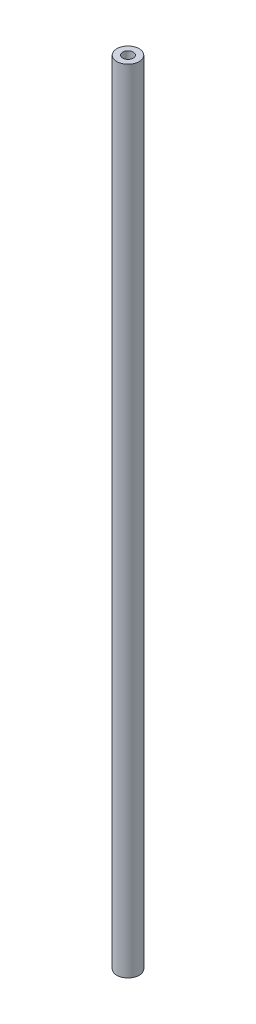
ISO-10303-21;
HEADER;
FILE_DESCRIPTION(('STEP AP214'),'2;1');
FILE_NAME('part.step','',(''),(''),'','','');
FILE_SCHEMA(('AUTOMOTIVE_DESIGN { 1 0 10303 214 1 1 1 1 }'));
ENDSEC;
DATA;
#1=APPLICATION_CONTEXT('core data for automotive mechanical design processes');
#2=APPLICATION_PROTOCOL_DEFINITION('international standard','automotive_design',2000,#1);
#3=PRODUCT_CONTEXT('',#1,'mechanical');
#4=PRODUCT('Part','Part','',(#3));
#5=PRODUCT_RELATED_PRODUCT_CATEGORY('part','',(#4));
#6=PRODUCT_DEFINITION_FORMATION('','',#4);
#7=PRODUCT_DEFINITION_CONTEXT('part definition',#1,'design');
#8=PRODUCT_DEFINITION('design','',#6,#7);
#9=PRODUCT_DEFINITION_SHAPE('','',#8);
#10=(LENGTH_UNIT() NAMED_UNIT(*) SI_UNIT(.MILLI.,.METRE.));
#11=(NAMED_UNIT(*) PLANE_ANGLE_UNIT() SI_UNIT($,.RADIAN.));
#12=(NAMED_UNIT(*) SI_UNIT($,.STERADIAN.) SOLID_ANGLE_UNIT());
#13=UNCERTAINTY_MEASURE_WITH_UNIT(LENGTH_MEASURE(1.E-05),#10,'distance_accuracy_value','');
#14=(GEOMETRIC_REPRESENTATION_CONTEXT(3) GLOBAL_UNCERTAINTY_ASSIGNED_CONTEXT((#13)) GLOBAL_UNIT_ASSIGNED_CONTEXT((#10,
#11,#12)) REPRESENTATION_CONTEXT('',''));
#15=CARTESIAN_POINT('',(0.,0.,0.));
#16=DIRECTION('',(0.,0.,1.));
#17=DIRECTION('',(1.,0.,0.));
#18=AXIS2_PLACEMENT_3D('',#15,#16,#17);
#19=CARTESIAN_POINT('',(0.,450.,0.));
#20=DIRECTION('',(0.,-1.,0.));
#21=DIRECTION('',(0.,0.,-1.));
#22=AXIS2_PLACEMENT_3D('',#19,#20,#21);
#23=CYLINDRICAL_SURFACE('',#22,6.35);
#24=CARTESIAN_POINT('',(0.,450.,0.));
#25=DIRECTION('',(0.,1.,0.));
#26=DIRECTION('',(0.,0.,1.));
#27=AXIS2_PLACEMENT_3D('',#24,#25,#26);
#28=CIRCLE('',#27,6.35);
#29=CARTESIAN_POINT('',(0.,450.,6.35));
#30=VERTEX_POINT('',#29);
#31=EDGE_CURVE('E10',#30,#30,#28,.T.);
#32=ORIENTED_EDGE('',*,*,#31,.F.);
#33=EDGE_LOOP('',(#32));
#34=FACE_BOUND('',#33,.T.);
#35=CARTESIAN_POINT('',(0.,0.,0.));
#36=DIRECTION('',(0.,1.,0.));
#37=DIRECTION('',(0.,0.,1.));
#38=AXIS2_PLACEMENT_3D('',#35,#36,#37);
#39=CIRCLE('',#38,6.35);
#40=CARTESIAN_POINT('',(0.,0.,6.35));
#41=VERTEX_POINT('',#40);
#42=EDGE_CURVE('E45',#41,#41,#39,.T.);
#43=ORIENTED_EDGE('',*,*,#42,.T.);
#44=EDGE_LOOP('',(#43));
#45=FACE_BOUND('',#44,.T.);
#46=ADVANCED_FACE('F39',(#34,#45),#23,.T.);
#47=CARTESIAN_POINT('',(0.,450.,0.));
#48=DIRECTION('',(0.,1.,0.));
#49=DIRECTION('',(0.,0.,1.));
#50=AXIS2_PLACEMENT_3D('',#47,#48,#49);
#51=PLANE('',#50);
#52=CARTESIAN_POINT('',(0.,450.,0.));
#53=DIRECTION('',(0.,1.,0.));
#54=DIRECTION('',(0.,0.,1.));
#55=AXIS2_PLACEMENT_3D('',#52,#53,#54);
#56=CIRCLE('',#55,3.);
#57=CARTESIAN_POINT('',(0.,450.,3.));
#58=VERTEX_POINT('',#57);
#59=EDGE_CURVE('E51',#58,#58,#56,.T.);
#60=ORIENTED_EDGE('',*,*,#59,.F.);
#61=EDGE_LOOP('',(#60));
#62=FACE_BOUND('',#61,.T.);
#63=ORIENTED_EDGE('',*,*,#31,.T.);
#64=EDGE_LOOP('',(#63));
#65=FACE_BOUND('',#64,.T.);
#66=ADVANCED_FACE('F79',(#62,#65),#51,.T.);
#67=CARTESIAN_POINT('',(0.,0.,0.));
#68=DIRECTION('',(0.,1.,0.));
#69=DIRECTION('',(0.,0.,1.));
#70=AXIS2_PLACEMENT_3D('',#67,#68,#69);
#71=PLANE('',#70);
#72=CARTESIAN_POINT('',(0.,0.,0.));
#73=DIRECTION('',(0.,-1.,0.));
#74=DIRECTION('',(0.,0.,-1.));
#75=AXIS2_PLACEMENT_3D('',#72,#73,#74);
#76=CIRCLE('',#75,3.);
#77=CARTESIAN_POINT('',(0.,0.,-3.));
#78=VERTEX_POINT('',#77);
#79=EDGE_CURVE('E60',#78,#78,#76,.T.);
#80=ORIENTED_EDGE('',*,*,#79,.F.);
#81=EDGE_LOOP('',(#80));
#82=FACE_BOUND('',#81,.T.);
#83=ORIENTED_EDGE('',*,*,#42,.F.);
#84=EDGE_LOOP('',(#83));
#85=FACE_BOUND('',#84,.T.);
#86=ADVANCED_FACE('F75',(#82,#85),#71,.F.);
#87=CARTESIAN_POINT('',(0.,426.,0.));
#88=DIRECTION('',(0.,1.,0.));
#89=DIRECTION('',(0.,0.,1.));
#90=AXIS2_PLACEMENT_3D('',#87,#88,#89);
#91=CYLINDRICAL_SURFACE('',#90,3.);
#92=CARTESIAN_POINT('',(0.,426.,0.));
#93=DIRECTION('',(0.,1.,0.));
#94=DIRECTION('',(0.,0.,1.));
#95=AXIS2_PLACEMENT_3D('',#92,#93,#94);
#96=CIRCLE('',#95,3.);
#97=CARTESIAN_POINT('',(0.,426.,3.));
#98=VERTEX_POINT('',#97);
#99=EDGE_CURVE('E47',#98,#98,#96,.T.);
#100=ORIENTED_EDGE('',*,*,#99,.F.);
#101=EDGE_LOOP('',(#100));
#102=FACE_BOUND('',#101,.T.);
#103=ORIENTED_EDGE('',*,*,#59,.T.);
#104=EDGE_LOOP('',(#103));
#105=FACE_BOUND('',#104,.T.);
#106=ADVANCED_FACE('F73',(#102,#105),#91,.F.);
#107=CARTESIAN_POINT('',(0.,426.,0.));
#108=DIRECTION('',(0.,1.,0.));
#109=DIRECTION('',(0.,0.,1.));
#110=AXIS2_PLACEMENT_3D('',#107,#108,#109);
#111=PLANE('',#110);
#112=ORIENTED_EDGE('',*,*,#99,.T.);
#113=EDGE_LOOP('',(#112));
#114=FACE_BOUND('',#113,.T.);
#115=ADVANCED_FACE('F68',(#114),#111,.T.);
#116=CARTESIAN_POINT('',(0.,24.,0.));
#117=DIRECTION('',(0.,-1.,0.));
#118=DIRECTION('',(0.,0.,-1.));
#119=AXIS2_PLACEMENT_3D('',#116,#117,#118);
#120=CYLINDRICAL_SURFACE('',#119,3.);
#121=CARTESIAN_POINT('',(0.,24.,0.));
#122=DIRECTION('',(0.,-1.,0.));
#123=DIRECTION('',(0.,0.,-1.));
#124=AXIS2_PLACEMENT_3D('',#121,#122,#123);
#125=CIRCLE('',#124,3.);
#126=CARTESIAN_POINT('',(0.,24.,-3.));
#127=VERTEX_POINT('',#126);
#128=EDGE_CURVE('E53',#127,#127,#125,.T.);
#129=ORIENTED_EDGE('',*,*,#128,.F.);
#130=EDGE_LOOP('',(#129));
#131=FACE_BOUND('',#130,.T.);
#132=ORIENTED_EDGE('',*,*,#79,.T.);
#133=EDGE_LOOP('',(#132));
#134=FACE_BOUND('',#133,.T.);
#135=ADVANCED_FACE('F62',(#131,#134),#120,.F.);
#136=CARTESIAN_POINT('',(0.,24.,0.));
#137=DIRECTION('',(0.,-1.,0.));
#138=DIRECTION('',(0.,0.,-1.));
#139=AXIS2_PLACEMENT_3D('',#136,#137,#138);
#140=PLANE('',#139);
#141=ORIENTED_EDGE('',*,*,#128,.T.);
#142=EDGE_LOOP('',(#141));
#143=FACE_BOUND('',#142,.T.);
#144=ADVANCED_FACE('F65',(#143),#140,.T.);
#145=CLOSED_SHELL('',(#46,#66,#86,#106,#115,#135,#144));
#146=MANIFOLD_SOLID_BREP('B2',#145);
#147=ADVANCED_BREP_SHAPE_REPRESENTATION('',(#18,#146),#14);
#148=SHAPE_DEFINITION_REPRESENTATION(#9,#147);
ENDSEC;
END-ISO-10303-21;
